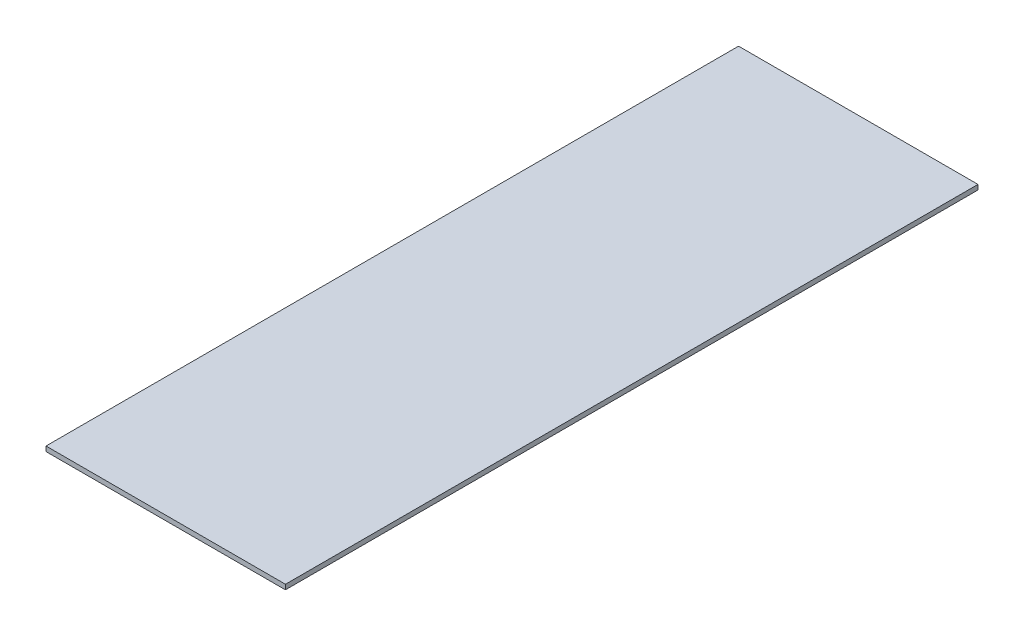
ISO-10303-21;
HEADER;
FILE_DESCRIPTION(('STEP AP214'),'2;1');
FILE_NAME('part.step','',(''),(''),'','','');
FILE_SCHEMA(('AUTOMOTIVE_DESIGN { 1 0 10303 214 1 1 1 1 }'));
ENDSEC;
DATA;
#1=APPLICATION_CONTEXT('core data for automotive mechanical design processes');
#2=APPLICATION_PROTOCOL_DEFINITION('international standard','automotive_design',2000,#1);
#3=PRODUCT_CONTEXT('',#1,'mechanical');
#4=PRODUCT('Part','Part','',(#3));
#5=PRODUCT_RELATED_PRODUCT_CATEGORY('part','',(#4));
#6=PRODUCT_DEFINITION_FORMATION('','',#4);
#7=PRODUCT_DEFINITION_CONTEXT('part definition',#1,'design');
#8=PRODUCT_DEFINITION('design','',#6,#7);
#9=PRODUCT_DEFINITION_SHAPE('','',#8);
#10=(LENGTH_UNIT() NAMED_UNIT(*) SI_UNIT(.MILLI.,.METRE.));
#11=(NAMED_UNIT(*) PLANE_ANGLE_UNIT() SI_UNIT($,.RADIAN.));
#12=(NAMED_UNIT(*) SI_UNIT($,.STERADIAN.) SOLID_ANGLE_UNIT());
#13=UNCERTAINTY_MEASURE_WITH_UNIT(LENGTH_MEASURE(1.E-05),#10,'distance_accuracy_value','');
#14=(GEOMETRIC_REPRESENTATION_CONTEXT(3) GLOBAL_UNCERTAINTY_ASSIGNED_CONTEXT((#13)) GLOBAL_UNIT_ASSIGNED_CONTEXT((#10,
#11,#12)) REPRESENTATION_CONTEXT('',''));
#15=CARTESIAN_POINT('',(0.,0.,0.));
#16=DIRECTION('',(0.,0.,1.));
#17=DIRECTION('',(1.,0.,0.));
#18=AXIS2_PLACEMENT_3D('',#15,#16,#17);
#19=CARTESIAN_POINT('',(78.3442542733582,70.1122475907308,-453.2));
#20=DIRECTION('',(1.,0.,0.));
#21=DIRECTION('',(0.,0.,-1.));
#22=AXIS2_PLACEMENT_3D('',#19,#20,#21);
#23=PLANE('',#22);
#24=DIRECTION('',(0.,1.,0.));
#25=VECTOR('',#24,1.);
#26=CARTESIAN_POINT('',(78.3442542733582,70.1122475907308,0.));
#27=LINE('',#26,#25);
#28=CARTESIAN_POINT('',(78.3442542733582,70.1122475907308,0.));
#29=VERTEX_POINT('',#28);
#30=CARTESIAN_POINT('',(78.3442542733582,73.2872475907308,0.));
#31=VERTEX_POINT('',#30);
#32=EDGE_CURVE('E103',#29,#31,#27,.T.);
#33=ORIENTED_EDGE('',*,*,#32,.F.);
#34=DIRECTION('',(0.,0.,1.));
#35=VECTOR('',#34,1.);
#36=CARTESIAN_POINT('',(78.3442542733582,70.1122475907308,-453.2));
#37=LINE('',#36,#35);
#38=CARTESIAN_POINT('',(78.3442542733582,70.1122475907308,-453.2));
#39=VERTEX_POINT('',#38);
#40=EDGE_CURVE('E11',#39,#29,#37,.T.);
#41=ORIENTED_EDGE('',*,*,#40,.F.);
#42=DIRECTION('',(0.,1.,0.));
#43=VECTOR('',#42,1.);
#44=CARTESIAN_POINT('',(78.3442542733582,70.1122475907308,-453.2));
#45=LINE('',#44,#43);
#46=CARTESIAN_POINT('',(78.3442542733582,73.2872475907308,-453.2));
#47=VERTEX_POINT('',#46);
#48=EDGE_CURVE('E100',#39,#47,#45,.T.);
#49=ORIENTED_EDGE('',*,*,#48,.T.);
#50=DIRECTION('',(0.,0.,1.));
#51=VECTOR('',#50,1.);
#52=CARTESIAN_POINT('',(78.3442542733582,73.2872475907308,-453.2));
#53=LINE('',#52,#51);
#54=EDGE_CURVE('E45',#47,#31,#53,.T.);
#55=ORIENTED_EDGE('',*,*,#54,.T.);
#56=EDGE_LOOP('',(#33,#41,#49,#55));
#57=FACE_BOUND('',#56,.T.);
#58=ADVANCED_FACE('F39',(#57),#23,.T.);
#59=CARTESIAN_POINT('',(-78.3442542733582,70.1122475907308,-453.2));
#60=DIRECTION('',(0.,-1.,0.));
#61=DIRECTION('',(0.,0.,-1.));
#62=AXIS2_PLACEMENT_3D('',#59,#60,#61);
#63=PLANE('',#62);
#64=DIRECTION('',(1.,0.,0.));
#65=VECTOR('',#64,1.);
#66=CARTESIAN_POINT('',(-78.3442542733582,70.1122475907308,0.));
#67=LINE('',#66,#65);
#68=CARTESIAN_POINT('',(-78.3442542733582,70.1122475907308,0.));
#69=VERTEX_POINT('',#68);
#70=EDGE_CURVE('E97',#69,#29,#67,.T.);
#71=ORIENTED_EDGE('',*,*,#70,.F.);
#72=DIRECTION('',(0.,0.,1.));
#73=VECTOR('',#72,1.);
#74=CARTESIAN_POINT('',(-78.3442542733582,70.1122475907308,-453.2));
#75=LINE('',#74,#73);
#76=CARTESIAN_POINT('',(-78.3442542733582,70.1122475907308,-453.2));
#77=VERTEX_POINT('',#76);
#78=EDGE_CURVE('E48',#77,#69,#75,.T.);
#79=ORIENTED_EDGE('',*,*,#78,.F.);
#80=DIRECTION('',(1.,0.,0.));
#81=VECTOR('',#80,1.);
#82=CARTESIAN_POINT('',(-78.3442542733582,70.1122475907308,-453.2));
#83=LINE('',#82,#81);
#84=EDGE_CURVE('E94',#77,#39,#83,.T.);
#85=ORIENTED_EDGE('',*,*,#84,.T.);
#86=ORIENTED_EDGE('',*,*,#40,.T.);
#87=EDGE_LOOP('',(#71,#79,#85,#86));
#88=FACE_BOUND('',#87,.T.);
#89=ADVANCED_FACE('F114',(#88),#63,.T.);
#90=CARTESIAN_POINT('',(-78.3442542733582,70.1122475907308,-453.2));
#91=DIRECTION('',(-1.,0.,0.));
#92=DIRECTION('',(0.,0.,1.));
#93=AXIS2_PLACEMENT_3D('',#90,#91,#92);
#94=PLANE('',#93);
#95=DIRECTION('',(0.,-1.,0.));
#96=VECTOR('',#95,1.);
#97=CARTESIAN_POINT('',(-78.3442542733582,70.1122475907308,0.));
#98=LINE('',#97,#96);
#99=CARTESIAN_POINT('',(-78.3442542733582,73.2872475907308,0.));
#100=VERTEX_POINT('',#99);
#101=EDGE_CURVE('E90',#100,#69,#98,.T.);
#102=ORIENTED_EDGE('',*,*,#101,.F.);
#103=DIRECTION('',(0.,0.,1.));
#104=VECTOR('',#103,1.);
#105=CARTESIAN_POINT('',(-78.3442542733582,73.2872475907308,-453.2));
#106=LINE('',#105,#104);
#107=CARTESIAN_POINT('',(-78.3442542733582,73.2872475907308,-453.2));
#108=VERTEX_POINT('',#107);
#109=EDGE_CURVE('E84',#108,#100,#106,.T.);
#110=ORIENTED_EDGE('',*,*,#109,.F.);
#111=DIRECTION('',(0.,-1.,0.));
#112=VECTOR('',#111,1.);
#113=CARTESIAN_POINT('',(-78.3442542733582,70.1122475907308,-453.2));
#114=LINE('',#113,#112);
#115=EDGE_CURVE('E87',#108,#77,#114,.T.);
#116=ORIENTED_EDGE('',*,*,#115,.T.);
#117=ORIENTED_EDGE('',*,*,#78,.T.);
#118=EDGE_LOOP('',(#102,#110,#116,#117));
#119=FACE_BOUND('',#118,.T.);
#120=ADVANCED_FACE('F88',(#119),#94,.T.);
#121=CARTESIAN_POINT('',(-78.3442542733582,73.2872475907308,-453.2));
#122=DIRECTION('',(0.,1.,0.));
#123=DIRECTION('',(0.,0.,1.));
#124=AXIS2_PLACEMENT_3D('',#121,#122,#123);
#125=PLANE('',#124);
#126=DIRECTION('',(-1.,0.,0.));
#127=VECTOR('',#126,1.);
#128=CARTESIAN_POINT('',(-78.3442542733582,73.2872475907308,0.));
#129=LINE('',#128,#127);
#130=EDGE_CURVE('E106',#31,#100,#129,.T.);
#131=ORIENTED_EDGE('',*,*,#130,.F.);
#132=ORIENTED_EDGE('',*,*,#54,.F.);
#133=DIRECTION('',(-1.,0.,0.));
#134=VECTOR('',#133,1.);
#135=CARTESIAN_POINT('',(-78.3442542733582,73.2872475907308,-453.2));
#136=LINE('',#135,#134);
#137=EDGE_CURVE('E91',#47,#108,#136,.T.);
#138=ORIENTED_EDGE('',*,*,#137,.T.);
#139=ORIENTED_EDGE('',*,*,#109,.T.);
#140=EDGE_LOOP('',(#131,#132,#138,#139));
#141=FACE_BOUND('',#140,.T.);
#142=ADVANCED_FACE('F96',(#141),#125,.T.);
#143=CARTESIAN_POINT('',(0.,0.,-453.2));
#144=DIRECTION('',(0.,0.,-1.));
#145=DIRECTION('',(-1.,0.,0.));
#146=AXIS2_PLACEMENT_3D('',#143,#144,#145);
#147=PLANE('',#146);
#148=ORIENTED_EDGE('',*,*,#48,.F.);
#149=ORIENTED_EDGE('',*,*,#84,.F.);
#150=ORIENTED_EDGE('',*,*,#115,.F.);
#151=ORIENTED_EDGE('',*,*,#137,.F.);
#152=EDGE_LOOP('',(#148,#149,#150,#151));
#153=FACE_BOUND('',#152,.T.);
#154=ADVANCED_FACE('F95',(#153),#147,.T.);
#155=CARTESIAN_POINT('',(0.,0.,0.));
#156=DIRECTION('',(0.,0.,-1.));
#157=DIRECTION('',(-1.,0.,0.));
#158=AXIS2_PLACEMENT_3D('',#155,#156,#157);
#159=PLANE('',#158);
#160=ORIENTED_EDGE('',*,*,#32,.T.);
#161=ORIENTED_EDGE('',*,*,#130,.T.);
#162=ORIENTED_EDGE('',*,*,#101,.T.);
#163=ORIENTED_EDGE('',*,*,#70,.T.);
#164=EDGE_LOOP('',(#160,#161,#162,#163));
#165=FACE_BOUND('',#164,.T.);
#166=ADVANCED_FACE('F115',(#165),#159,.F.);
#167=CLOSED_SHELL('',(#58,#89,#120,#142,#154,#166));
#168=MANIFOLD_SOLID_BREP('B2',#167);
#169=ADVANCED_BREP_SHAPE_REPRESENTATION('',(#18,#168),#14);
#170=SHAPE_DEFINITION_REPRESENTATION(#9,#169);
ENDSEC;
END-ISO-10303-21;
